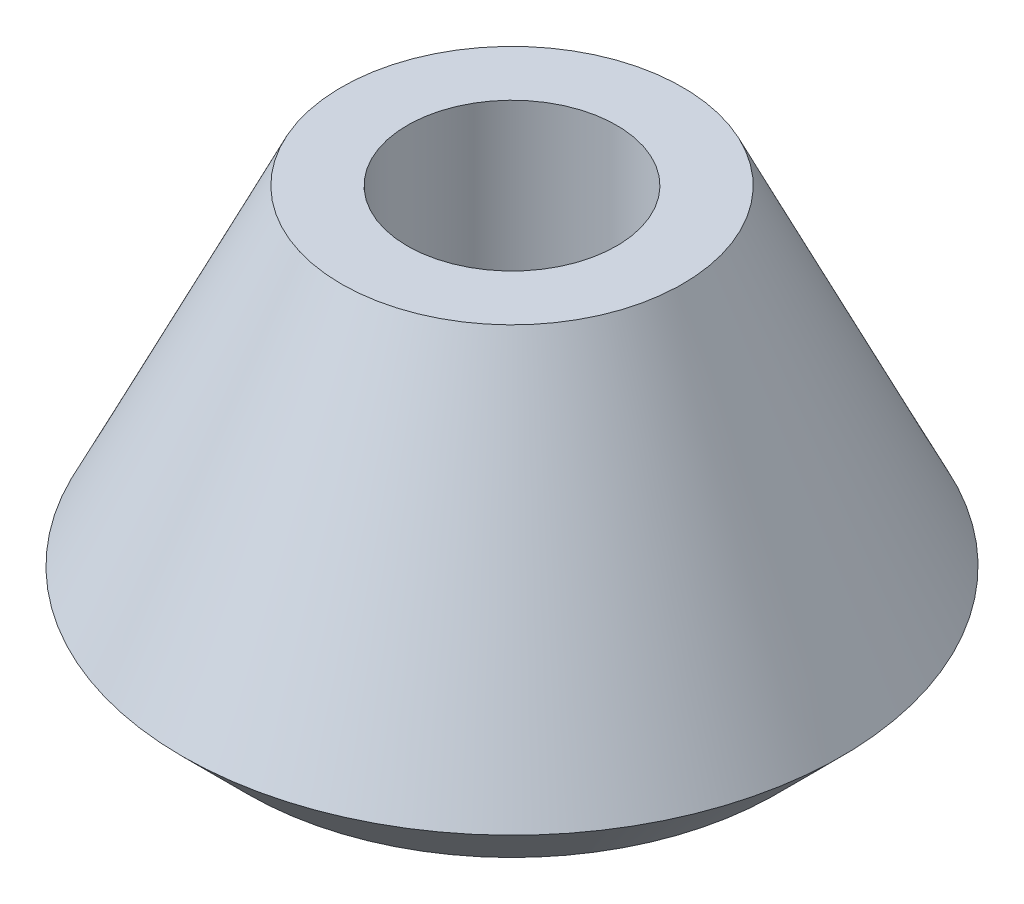
ISO-10303-21;
HEADER;
FILE_DESCRIPTION(('STEP AP214'),'2;1');
FILE_NAME('part.step','',(''),(''),'','','');
FILE_SCHEMA(('AUTOMOTIVE_DESIGN { 1 0 10303 214 1 1 1 1 }'));
ENDSEC;
DATA;
#1=APPLICATION_CONTEXT('core data for automotive mechanical design processes');
#2=APPLICATION_PROTOCOL_DEFINITION('international standard','automotive_design',2000,#1);
#3=PRODUCT_CONTEXT('',#1,'mechanical');
#4=PRODUCT('Part','Part','',(#3));
#5=PRODUCT_RELATED_PRODUCT_CATEGORY('part','',(#4));
#6=PRODUCT_DEFINITION_FORMATION('','',#4);
#7=PRODUCT_DEFINITION_CONTEXT('part definition',#1,'design');
#8=PRODUCT_DEFINITION('design','',#6,#7);
#9=PRODUCT_DEFINITION_SHAPE('','',#8);
#10=(LENGTH_UNIT() NAMED_UNIT(*) SI_UNIT(.MILLI.,.METRE.));
#11=(NAMED_UNIT(*) PLANE_ANGLE_UNIT() SI_UNIT($,.RADIAN.));
#12=(NAMED_UNIT(*) SI_UNIT($,.STERADIAN.) SOLID_ANGLE_UNIT());
#13=UNCERTAINTY_MEASURE_WITH_UNIT(LENGTH_MEASURE(1.E-05),#10,'distance_accuracy_value','');
#14=(GEOMETRIC_REPRESENTATION_CONTEXT(3) GLOBAL_UNCERTAINTY_ASSIGNED_CONTEXT((#13)) GLOBAL_UNIT_ASSIGNED_CONTEXT((#10,
#11,#12)) REPRESENTATION_CONTEXT('',''));
#15=CARTESIAN_POINT('',(0.,0.,0.));
#16=DIRECTION('',(0.,0.,1.));
#17=DIRECTION('',(1.,0.,0.));
#18=AXIS2_PLACEMENT_3D('',#15,#16,#17);
#19=CARTESIAN_POINT('',(20.,0.,0.));
#20=DIRECTION('',(0.,1.,0.));
#21=DIRECTION('',(0.,0.,1.));
#22=AXIS2_PLACEMENT_3D('',#19,#20,#21);
#23=PLANE('',#22);
#24=CARTESIAN_POINT('',(0.,0.,0.));
#25=DIRECTION('',(0.,1.,0.));
#26=DIRECTION('',(0.,0.,1.));
#27=AXIS2_PLACEMENT_3D('',#24,#25,#26);
#28=CIRCLE('',#27,20.);
#29=CARTESIAN_POINT('',(0.,0.,20.));
#30=VERTEX_POINT('',#29);
#31=EDGE_CURVE('E60',#30,#30,#28,.T.);
#32=ORIENTED_EDGE('',*,*,#31,.F.);
#33=EDGE_LOOP('',(#32));
#34=FACE_BOUND('',#33,.T.);
#35=CARTESIAN_POINT('',(0.,0.,0.));
#36=DIRECTION('',(0.,1.,0.));
#37=DIRECTION('',(0.,0.,1.));
#38=AXIS2_PLACEMENT_3D('',#35,#36,#37);
#39=CIRCLE('',#38,7.9375);
#40=CARTESIAN_POINT('',(0.,0.,7.9375));
#41=VERTEX_POINT('',#40);
#42=EDGE_CURVE('E10',#41,#41,#39,.T.);
#43=ORIENTED_EDGE('',*,*,#42,.T.);
#44=EDGE_LOOP('',(#43));
#45=FACE_BOUND('',#44,.T.);
#46=ADVANCED_FACE('F36',(#34,#45),#23,.F.);
#47=CARTESIAN_POINT('',(0.,4.04812500000001,0.));
#48=DIRECTION('',(0.,1.,0.));
#49=DIRECTION('',(0.,0.,1.));
#50=AXIS2_PLACEMENT_3D('',#47,#48,#49);
#51=CYLINDRICAL_SURFACE('',#50,7.9375);
#52=ORIENTED_EDGE('',*,*,#42,.F.);
#53=EDGE_LOOP('',(#52));
#54=FACE_BOUND('',#53,.T.);
#55=CARTESIAN_POINT('',(0.,30.,0.));
#56=DIRECTION('',(0.,1.,0.));
#57=DIRECTION('',(0.,0.,1.));
#58=AXIS2_PLACEMENT_3D('',#55,#56,#57);
#59=CIRCLE('',#58,7.9375);
#60=CARTESIAN_POINT('',(0.,30.,7.9375));
#61=VERTEX_POINT('',#60);
#62=EDGE_CURVE('E43',#61,#61,#59,.T.);
#63=ORIENTED_EDGE('',*,*,#62,.T.);
#64=EDGE_LOOP('',(#63));
#65=FACE_BOUND('',#64,.T.);
#66=ADVANCED_FACE('F67',(#54,#65),#51,.F.);
#67=CARTESIAN_POINT('',(7.9375,30.,0.));
#68=DIRECTION('',(0.,-1.,0.));
#69=DIRECTION('',(0.,0.,-1.));
#70=AXIS2_PLACEMENT_3D('',#67,#68,#69);
#71=PLANE('',#70);
#72=ORIENTED_EDGE('',*,*,#62,.F.);
#73=EDGE_LOOP('',(#72));
#74=FACE_BOUND('',#73,.T.);
#75=CARTESIAN_POINT('',(0.,30.,0.));
#76=DIRECTION('',(0.,1.,0.));
#77=DIRECTION('',(0.,0.,1.));
#78=AXIS2_PLACEMENT_3D('',#75,#76,#77);
#79=CIRCLE('',#78,12.9375);
#80=CARTESIAN_POINT('',(0.,30.,12.9375));
#81=VERTEX_POINT('',#80);
#82=EDGE_CURVE('E50',#81,#81,#79,.T.);
#83=ORIENTED_EDGE('',*,*,#82,.T.);
#84=EDGE_LOOP('',(#83));
#85=FACE_BOUND('',#84,.T.);
#86=ADVANCED_FACE('F71',(#74,#85),#71,.F.);
#87=CARTESIAN_POINT('',(0.,5.00000000000002,0.));
#88=DIRECTION('',(0.,-1.,0.));
#89=DIRECTION('',(0.,0.,-1.));
#90=AXIS2_PLACEMENT_3D('',#87,#88,#89);
#91=CONICAL_SURFACE('',#90,25.,0.449549852200311);
#92=ORIENTED_EDGE('',*,*,#82,.F.);
#93=EDGE_LOOP('',(#92));
#94=FACE_BOUND('',#93,.T.);
#95=CARTESIAN_POINT('',(0.,5.00000000000002,0.));
#96=DIRECTION('',(0.,1.,0.));
#97=DIRECTION('',(0.,0.,1.));
#98=AXIS2_PLACEMENT_3D('',#95,#96,#97);
#99=CIRCLE('',#98,25.);
#100=CARTESIAN_POINT('',(0.,5.00000000000002,25.));
#101=VERTEX_POINT('',#100);
#102=EDGE_CURVE('E55',#101,#101,#99,.T.);
#103=ORIENTED_EDGE('',*,*,#102,.T.);
#104=EDGE_LOOP('',(#103));
#105=FACE_BOUND('',#104,.T.);
#106=ADVANCED_FACE('F76',(#94,#105),#91,.T.);
#107=CARTESIAN_POINT('',(0.,0.,0.));
#108=DIRECTION('',(0.,1.,0.));
#109=DIRECTION('',(0.,0.,1.));
#110=AXIS2_PLACEMENT_3D('',#107,#108,#109);
#111=CONICAL_SURFACE('',#110,20.,0.785398163397446);
#112=ORIENTED_EDGE('',*,*,#102,.F.);
#113=EDGE_LOOP('',(#112));
#114=FACE_BOUND('',#113,.T.);
#115=ORIENTED_EDGE('',*,*,#31,.T.);
#116=EDGE_LOOP('',(#115));
#117=FACE_BOUND('',#116,.T.);
#118=ADVANCED_FACE('F64',(#114,#117),#111,.T.);
#119=CLOSED_SHELL('',(#46,#66,#86,#106,#118));
#120=MANIFOLD_SOLID_BREP('B2',#119);
#121=ADVANCED_BREP_SHAPE_REPRESENTATION('',(#18,#120),#14);
#122=SHAPE_DEFINITION_REPRESENTATION(#9,#121);
ENDSEC;
END-ISO-10303-21;
